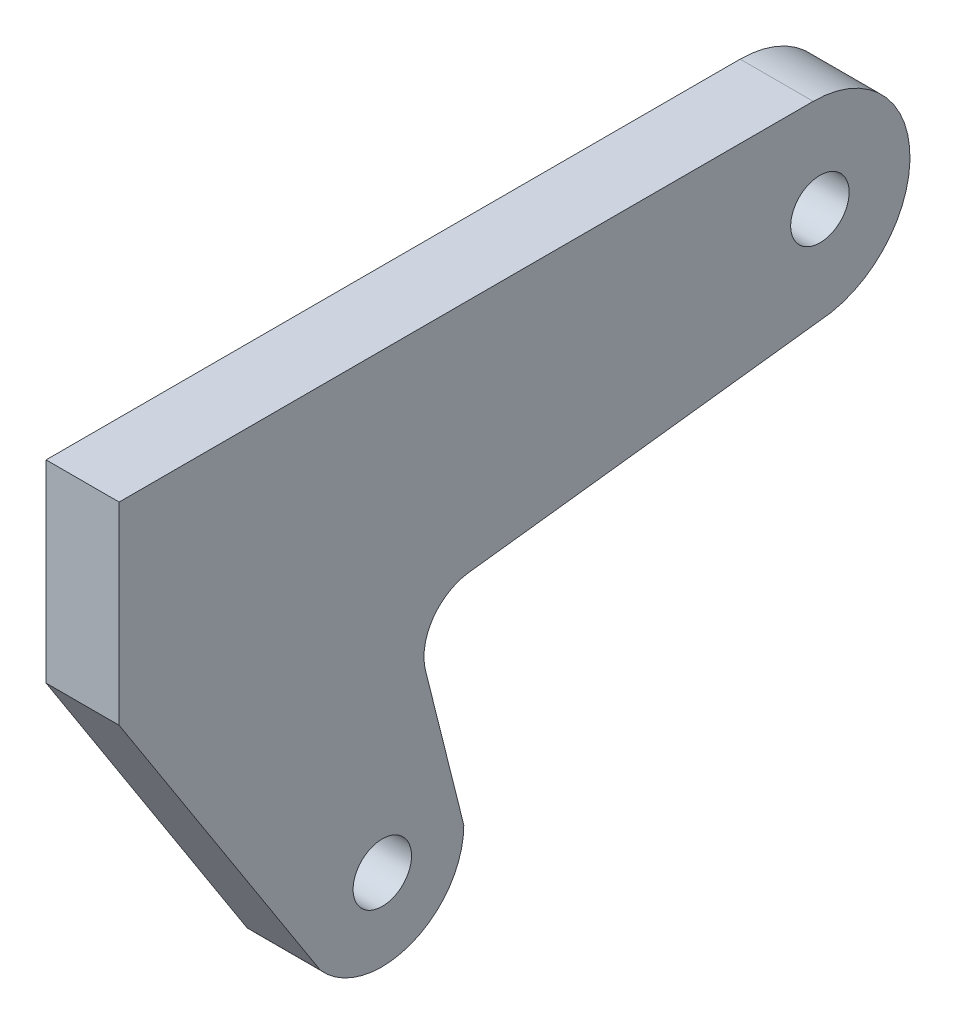
ISO-10303-21;
HEADER;
FILE_DESCRIPTION(('STEP AP214'),'2;1');
FILE_NAME('part.step','',(''),(''),'','','');
FILE_SCHEMA(('AUTOMOTIVE_DESIGN { 1 0 10303 214 1 1 1 1 }'));
ENDSEC;
DATA;
#1=APPLICATION_CONTEXT('core data for automotive mechanical design processes');
#2=APPLICATION_PROTOCOL_DEFINITION('international standard','automotive_design',2000,#1);
#3=PRODUCT_CONTEXT('',#1,'mechanical');
#4=PRODUCT('Part','Part','',(#3));
#5=PRODUCT_RELATED_PRODUCT_CATEGORY('part','',(#4));
#6=PRODUCT_DEFINITION_FORMATION('','',#4);
#7=PRODUCT_DEFINITION_CONTEXT('part definition',#1,'design');
#8=PRODUCT_DEFINITION('design','',#6,#7);
#9=PRODUCT_DEFINITION_SHAPE('','',#8);
#10=(LENGTH_UNIT() NAMED_UNIT(*) SI_UNIT(.MILLI.,.METRE.));
#11=(NAMED_UNIT(*) PLANE_ANGLE_UNIT() SI_UNIT($,.RADIAN.));
#12=(NAMED_UNIT(*) SI_UNIT($,.STERADIAN.) SOLID_ANGLE_UNIT());
#13=UNCERTAINTY_MEASURE_WITH_UNIT(LENGTH_MEASURE(1.E-05),#10,'distance_accuracy_value','');
#14=(GEOMETRIC_REPRESENTATION_CONTEXT(3) GLOBAL_UNCERTAINTY_ASSIGNED_CONTEXT((#13)) GLOBAL_UNIT_ASSIGNED_CONTEXT((#10,
#11,#12)) REPRESENTATION_CONTEXT('',''));
#15=CARTESIAN_POINT('',(0.,0.,0.));
#16=DIRECTION('',(0.,0.,1.));
#17=DIRECTION('',(1.,0.,0.));
#18=AXIS2_PLACEMENT_3D('',#15,#16,#17);
#19=CARTESIAN_POINT('',(10.,0.,0.));
#20=DIRECTION('',(0.,-1.,0.));
#21=DIRECTION('',(0.,0.,-1.));
#22=AXIS2_PLACEMENT_3D('',#19,#20,#21);
#23=PLANE('',#22);
#24=DIRECTION('',(0.,0.,1.));
#25=VECTOR('',#24,1.);
#26=CARTESIAN_POINT('',(0.,0.,0.));
#27=LINE('',#26,#25);
#28=CARTESIAN_POINT('',(0.,1.07552855510562E-13,-94.9883133321983));
#29=VERTEX_POINT('',#28);
#30=CARTESIAN_POINT('',(0.,0.,0.));
#31=VERTEX_POINT('',#30);
#32=EDGE_CURVE('E127',#29,#31,#27,.T.);
#33=ORIENTED_EDGE('',*,*,#32,.T.);
#34=DIRECTION('',(-1.,0.,0.));
#35=VECTOR('',#34,1.);
#36=CARTESIAN_POINT('',(10.,0.,0.));
#37=LINE('',#36,#35);
#38=CARTESIAN_POINT('',(10.,0.,0.));
#39=VERTEX_POINT('',#38);
#40=EDGE_CURVE('E11',#39,#31,#37,.T.);
#41=ORIENTED_EDGE('',*,*,#40,.F.);
#42=DIRECTION('',(0.,0.,1.));
#43=VECTOR('',#42,1.);
#44=CARTESIAN_POINT('',(10.,0.,0.));
#45=LINE('',#44,#43);
#46=CARTESIAN_POINT('',(10.,1.07552855510562E-13,-94.9883133321983));
#47=VERTEX_POINT('',#46);
#48=EDGE_CURVE('E142',#47,#39,#45,.T.);
#49=ORIENTED_EDGE('',*,*,#48,.F.);
#50=DIRECTION('',(-1.,0.,0.));
#51=VECTOR('',#50,1.);
#52=CARTESIAN_POINT('',(10.,1.07552855510562E-13,-94.9883133321983));
#53=LINE('',#52,#51);
#54=EDGE_CURVE('E123',#47,#29,#53,.T.);
#55=ORIENTED_EDGE('',*,*,#54,.T.);
#56=EDGE_LOOP('',(#33,#41,#49,#55));
#57=FACE_BOUND('',#56,.T.);
#58=ADVANCED_FACE('F31',(#57),#23,.F.);
#59=CARTESIAN_POINT('',(10.,0.,0.));
#60=DIRECTION('',(0.,-1.76242441378472E-13,-1.));
#61=DIRECTION('',(0.,1.,-1.76242441378472E-13));
#62=AXIS2_PLACEMENT_3D('',#59,#60,#61);
#63=PLANE('',#62);
#64=DIRECTION('',(0.,-1.,1.76242441378472E-13));
#65=VECTOR('',#64,1.);
#66=CARTESIAN_POINT('',(0.,0.,0.));
#67=LINE('',#66,#65);
#68=CARTESIAN_POINT('',(0.,-26.45751311066,4.66293670342566E-12));
#69=VERTEX_POINT('',#68);
#70=EDGE_CURVE('E130',#31,#69,#67,.T.);
#71=ORIENTED_EDGE('',*,*,#70,.T.);
#72=DIRECTION('',(-1.,0.,0.));
#73=VECTOR('',#72,1.);
#74=CARTESIAN_POINT('',(10.,-26.45751311066,4.66293670342566E-12));
#75=LINE('',#74,#73);
#76=CARTESIAN_POINT('',(10.,-26.45751311066,4.66293670342566E-12));
#77=VERTEX_POINT('',#76);
#78=EDGE_CURVE('E39',#77,#69,#75,.T.);
#79=ORIENTED_EDGE('',*,*,#78,.F.);
#80=DIRECTION('',(0.,-1.,1.76242441378472E-13));
#81=VECTOR('',#80,1.);
#82=CARTESIAN_POINT('',(10.,0.,0.));
#83=LINE('',#82,#81);
#84=EDGE_CURVE('E90',#39,#77,#83,.T.);
#85=ORIENTED_EDGE('',*,*,#84,.F.);
#86=ORIENTED_EDGE('',*,*,#40,.T.);
#87=EDGE_LOOP('',(#71,#79,#85,#86));
#88=FACE_BOUND('',#87,.T.);
#89=ADVANCED_FACE('F211',(#88),#63,.F.);
#90=CARTESIAN_POINT('',(10.,-26.45751311066,4.66293670342566E-12));
#91=DIRECTION('',(0.,0.541064822227858,-0.840980890477029));
#92=DIRECTION('',(0.,0.840980890477029,0.541064822227858));
#93=AXIS2_PLACEMENT_3D('',#90,#91,#92);
#94=PLANE('',#93);
#95=DIRECTION('',(0.,-0.840980890477029,-0.541064822227858));
#96=VECTOR('',#95,1.);
#97=CARTESIAN_POINT('',(0.,-26.45751311066,4.66293670342566E-12));
#98=LINE('',#97,#96);
#99=CARTESIAN_POINT('',(0.,-69.2326518230064,-27.5203908736091));
#100=VERTEX_POINT('',#99);
#101=EDGE_CURVE('E133',#69,#100,#98,.T.);
#102=ORIENTED_EDGE('',*,*,#101,.T.);
#103=DIRECTION('',(-1.,0.,0.));
#104=VECTOR('',#103,1.);
#105=CARTESIAN_POINT('',(10.,-69.2326518230064,-27.5203908736091));
#106=LINE('',#105,#104);
#107=CARTESIAN_POINT('',(10.,-69.2326518230064,-27.5203908736091));
#108=VERTEX_POINT('',#107);
#109=EDGE_CURVE('E149',#108,#100,#106,.T.);
#110=ORIENTED_EDGE('',*,*,#109,.F.);
#111=DIRECTION('',(0.,-0.840980890477029,-0.541064822227858));
#112=VECTOR('',#111,1.);
#113=CARTESIAN_POINT('',(10.,-26.45751311066,4.66293670342566E-12));
#114=LINE('',#113,#112);
#115=EDGE_CURVE('E157',#77,#108,#114,.T.);
#116=ORIENTED_EDGE('',*,*,#115,.F.);
#117=ORIENTED_EDGE('',*,*,#78,.T.);
#118=EDGE_LOOP('',(#102,#110,#116,#117));
#119=FACE_BOUND('',#118,.T.);
#120=ADVANCED_FACE('F155',(#119),#94,.F.);
#121=CARTESIAN_POINT('',(10.,-61.8708429752599,-35.9650885838064));
#122=DIRECTION('',(-1.,0.,0.));
#123=DIRECTION('',(0.,0.,1.));
#124=AXIS2_PLACEMENT_3D('',#121,#122,#123);
#125=CYLINDRICAL_SURFACE('',#124,11.2030865803746);
#126=CARTESIAN_POINT('',(0.,-61.8708429752599,-35.9650885838064));
#127=DIRECTION('',(1.,0.,0.));
#128=DIRECTION('',(0.,0.,-1.));
#129=AXIS2_PLACEMENT_3D('',#126,#127,#128);
#130=CIRCLE('',#129,11.2030865803746);
#131=CARTESIAN_POINT('',(0.,-61.8708429752599,-47.1681751641811));
#132=VERTEX_POINT('',#131);
#133=EDGE_CURVE('E135',#100,#132,#130,.T.);
#134=ORIENTED_EDGE('',*,*,#133,.T.);
#135=DIRECTION('',(-1.,0.,0.));
#136=VECTOR('',#135,1.);
#137=CARTESIAN_POINT('',(10.,-61.8708429752599,-47.1681751641811));
#138=LINE('',#137,#136);
#139=CARTESIAN_POINT('',(10.,-61.8708429752599,-47.1681751641811));
#140=VERTEX_POINT('',#139);
#141=EDGE_CURVE('E146',#140,#132,#138,.T.);
#142=ORIENTED_EDGE('',*,*,#141,.F.);
#143=CARTESIAN_POINT('',(10.,-61.8708429752599,-35.9650885838064));
#144=DIRECTION('',(1.,0.,0.));
#145=DIRECTION('',(0.,0.,-1.));
#146=AXIS2_PLACEMENT_3D('',#143,#144,#145);
#147=CIRCLE('',#146,11.2030865803746);
#148=EDGE_CURVE('E169',#108,#140,#147,.T.);
#149=ORIENTED_EDGE('',*,*,#148,.F.);
#150=ORIENTED_EDGE('',*,*,#109,.T.);
#151=EDGE_LOOP('',(#134,#142,#149,#150));
#152=FACE_BOUND('',#151,.T.);
#153=ADVANCED_FACE('F165',(#152),#125,.T.);
#154=CARTESIAN_POINT('',(10.,-40.9215711840878,-41.9252592829969));
#155=DIRECTION('',(0.,-0.242779588289773,0.97008147673783));
#156=DIRECTION('',(0.,-0.97008147673783,-0.242779588289773));
#157=AXIS2_PLACEMENT_3D('',#154,#155,#156);
#158=PLANE('',#157);
#159=DIRECTION('',(0.,0.970081476737829,0.242779588289773));
#160=VECTOR('',#159,1.);
#161=CARTESIAN_POINT('',(0.,-40.9215711840878,-41.9252592829969));
#162=LINE('',#161,#160);
#163=CARTESIAN_POINT('',(0.,-40.9215711840878,-41.9252592829969));
#164=VERTEX_POINT('',#163);
#165=EDGE_CURVE('E137',#132,#164,#162,.T.);
#166=ORIENTED_EDGE('',*,*,#165,.T.);
#167=DIRECTION('',(-1.,0.,0.));
#168=VECTOR('',#167,1.);
#169=CARTESIAN_POINT('',(10.,-40.9215711840878,-41.9252592829969));
#170=LINE('',#169,#168);
#171=CARTESIAN_POINT('',(10.,-40.9215711840878,-41.9252592829969));
#172=VERTEX_POINT('',#171);
#173=EDGE_CURVE('E118',#172,#164,#170,.T.);
#174=ORIENTED_EDGE('',*,*,#173,.F.);
#175=DIRECTION('',(0.,0.970081476737829,0.242779588289773));
#176=VECTOR('',#175,1.);
#177=CARTESIAN_POINT('',(10.,-40.9215711840878,-41.9252592829969));
#178=LINE('',#177,#176);
#179=EDGE_CURVE('E109',#140,#172,#178,.T.);
#180=ORIENTED_EDGE('',*,*,#179,.F.);
#181=ORIENTED_EDGE('',*,*,#141,.T.);
#182=EDGE_LOOP('',(#166,#174,#180,#181));
#183=FACE_BOUND('',#182,.T.);
#184=ADVANCED_FACE('F168',(#183),#158,.F.);
#185=CARTESIAN_POINT('',(10.,-39.2221140660595,-48.7158296201617));
#186=DIRECTION('',(-1.,0.,0.));
#187=DIRECTION('',(0.,0.,1.));
#188=AXIS2_PLACEMENT_3D('',#185,#186,#187);
#189=CYLINDRICAL_SURFACE('',#188,6.99999999999999);
#190=CARTESIAN_POINT('',(0.,-39.2221140660595,-48.7158296201617));
#191=DIRECTION('',(-1.,0.,0.));
#192=DIRECTION('',(0.,0.,-1.));
#193=AXIS2_PLACEMENT_3D('',#190,#191,#192);
#194=CIRCLE('',#193,6.99999999999999);
#195=CARTESIAN_POINT('',(0.,-32.273126802079,-47.8722799742973));
#196=VERTEX_POINT('',#195);
#197=EDGE_CURVE('E117',#164,#196,#194,.T.);
#198=ORIENTED_EDGE('',*,*,#197,.T.);
#199=DIRECTION('',(-1.,0.,0.));
#200=VECTOR('',#199,1.);
#201=CARTESIAN_POINT('',(10.,-32.273126802079,-47.8722799742973));
#202=LINE('',#201,#200);
#203=CARTESIAN_POINT('',(10.,-32.273126802079,-47.8722799742973));
#204=VERTEX_POINT('',#203);
#205=EDGE_CURVE('E114',#204,#196,#202,.T.);
#206=ORIENTED_EDGE('',*,*,#205,.F.);
#207=CARTESIAN_POINT('',(10.,-39.2221140660595,-48.7158296201617));
#208=DIRECTION('',(-1.,0.,0.));
#209=DIRECTION('',(0.,0.,-1.));
#210=AXIS2_PLACEMENT_3D('',#207,#208,#209);
#211=CIRCLE('',#210,6.99999999999999);
#212=EDGE_CURVE('E103',#172,#204,#211,.T.);
#213=ORIENTED_EDGE('',*,*,#212,.F.);
#214=ORIENTED_EDGE('',*,*,#173,.T.);
#215=EDGE_LOOP('',(#198,#206,#213,#214));
#216=FACE_BOUND('',#215,.T.);
#217=ADVANCED_FACE('F115',(#216),#189,.F.);
#218=CARTESIAN_POINT('',(10.,-26.4575131106546,-95.7801010160695));
#219=DIRECTION('',(0.,0.992712466282911,0.120507092266392));
#220=DIRECTION('',(0.,-0.120507092266392,0.992712466282911));
#221=AXIS2_PLACEMENT_3D('',#218,#219,#220);
#222=PLANE('',#221);
#223=DIRECTION('',(0.,0.120507092266392,-0.992712466282911));
#224=VECTOR('',#223,1.);
#225=CARTESIAN_POINT('',(0.,-26.4575131106546,-95.7801010160695));
#226=LINE('',#225,#224);
#227=CARTESIAN_POINT('',(0.,-26.4575131106546,-95.7801010160695));
#228=VERTEX_POINT('',#227);
#229=EDGE_CURVE('E76',#196,#228,#226,.T.);
#230=ORIENTED_EDGE('',*,*,#229,.T.);
#231=DIRECTION('',(-1.,0.,0.));
#232=VECTOR('',#231,1.);
#233=CARTESIAN_POINT('',(10.,-26.4575131106546,-95.7801010160695));
#234=LINE('',#233,#232);
#235=CARTESIAN_POINT('',(10.,-26.4575131106546,-95.7801010160695));
#236=VERTEX_POINT('',#235);
#237=EDGE_CURVE('E119',#236,#228,#234,.T.);
#238=ORIENTED_EDGE('',*,*,#237,.F.);
#239=DIRECTION('',(0.,0.120507092266392,-0.992712466282911));
#240=VECTOR('',#239,1.);
#241=CARTESIAN_POINT('',(10.,-26.4575131106546,-95.7801010160695));
#242=LINE('',#241,#240);
#243=EDGE_CURVE('E107',#204,#236,#242,.T.);
#244=ORIENTED_EDGE('',*,*,#243,.F.);
#245=ORIENTED_EDGE('',*,*,#205,.T.);
#246=EDGE_LOOP('',(#230,#238,#244,#245));
#247=FACE_BOUND('',#246,.T.);
#248=ADVANCED_FACE('F121',(#247),#222,.F.);
#249=CARTESIAN_POINT('',(10.,-13.240604375901,-94.9883133321983));
#250=DIRECTION('',(-1.,0.,0.));
#251=DIRECTION('',(0.,0.,1.));
#252=AXIS2_PLACEMENT_3D('',#249,#250,#251);
#253=CYLINDRICAL_SURFACE('',#252,13.2406043759011);
#254=CARTESIAN_POINT('',(0.,-13.240604375901,-94.9883133321983));
#255=DIRECTION('',(1.,0.,0.));
#256=DIRECTION('',(0.,0.,1.));
#257=AXIS2_PLACEMENT_3D('',#254,#255,#256);
#258=CIRCLE('',#257,13.2406043759011);
#259=EDGE_CURVE('E82',#228,#29,#258,.T.);
#260=ORIENTED_EDGE('',*,*,#259,.T.);
#261=ORIENTED_EDGE('',*,*,#54,.F.);
#262=CARTESIAN_POINT('',(10.,-13.240604375901,-94.9883133321983));
#263=DIRECTION('',(1.,0.,0.));
#264=DIRECTION('',(0.,0.,1.));
#265=AXIS2_PLACEMENT_3D('',#262,#263,#264);
#266=CIRCLE('',#265,13.2406043759011);
#267=EDGE_CURVE('E47',#236,#47,#266,.T.);
#268=ORIENTED_EDGE('',*,*,#267,.F.);
#269=ORIENTED_EDGE('',*,*,#237,.T.);
#270=EDGE_LOOP('',(#260,#261,#268,#269));
#271=FACE_BOUND('',#270,.T.);
#272=ADVANCED_FACE('F198',(#271),#253,.T.);
#273=CARTESIAN_POINT('',(10.,-13.240604375901,-94.9883133321983));
#274=DIRECTION('',(-1.,0.,0.));
#275=DIRECTION('',(0.,0.,1.));
#276=AXIS2_PLACEMENT_3D('',#273,#274,#275);
#277=PLANE('',#276);
#278=CARTESIAN_POINT('',(10.,-61.9267327378232,-36.0154129928026));
#279=DIRECTION('',(1.,0.,0.));
#280=DIRECTION('',(0.,0.,-1.));
#281=AXIS2_PLACEMENT_3D('',#278,#279,#280);
#282=CIRCLE('',#281,4.00000000000001);
#283=CARTESIAN_POINT('',(10.,-61.9267327378232,-40.0154129928026));
#284=VERTEX_POINT('',#283);
#285=EDGE_CURVE('E181',#284,#284,#282,.T.);
#286=ORIENTED_EDGE('',*,*,#285,.F.);
#287=EDGE_LOOP('',(#286));
#288=FACE_BOUND('',#287,.T.);
#289=CARTESIAN_POINT('',(10.,-13.2287565553229,-95.9043978258456));
#290=DIRECTION('',(1.,0.,0.));
#291=DIRECTION('',(0.,0.,-1.));
#292=AXIS2_PLACEMENT_3D('',#289,#290,#291);
#293=CIRCLE('',#292,4.00000000000003);
#294=CARTESIAN_POINT('',(10.,-13.2287565553229,-99.9043978258456));
#295=VERTEX_POINT('',#294);
#296=EDGE_CURVE('E175',#295,#295,#293,.T.);
#297=ORIENTED_EDGE('',*,*,#296,.F.);
#298=EDGE_LOOP('',(#297));
#299=FACE_BOUND('',#298,.T.);
#300=ORIENTED_EDGE('',*,*,#48,.T.);
#301=ORIENTED_EDGE('',*,*,#84,.T.);
#302=ORIENTED_EDGE('',*,*,#115,.T.);
#303=ORIENTED_EDGE('',*,*,#148,.T.);
#304=ORIENTED_EDGE('',*,*,#179,.T.);
#305=ORIENTED_EDGE('',*,*,#212,.T.);
#306=ORIENTED_EDGE('',*,*,#243,.T.);
#307=ORIENTED_EDGE('',*,*,#267,.T.);
#308=EDGE_LOOP('',(#300,#301,#302,#303,#304,#305,#306,#307));
#309=FACE_BOUND('',#308,.T.);
#310=ADVANCED_FACE('F105',(#288,#299,#309),#277,.F.);
#311=CARTESIAN_POINT('',(0.,-13.240604375901,-94.9883133321983));
#312=DIRECTION('',(-1.,0.,0.));
#313=DIRECTION('',(0.,0.,1.));
#314=AXIS2_PLACEMENT_3D('',#311,#312,#313);
#315=PLANE('',#314);
#316=CARTESIAN_POINT('',(0.,-61.9267327378232,-36.0154129928026));
#317=DIRECTION('',(1.,0.,0.));
#318=DIRECTION('',(0.,0.,-1.));
#319=AXIS2_PLACEMENT_3D('',#316,#317,#318);
#320=CIRCLE('',#319,4.00000000000001);
#321=CARTESIAN_POINT('',(0.,-61.9267327378232,-40.0154129928026));
#322=VERTEX_POINT('',#321);
#323=EDGE_CURVE('E178',#322,#322,#320,.T.);
#324=ORIENTED_EDGE('',*,*,#323,.T.);
#325=EDGE_LOOP('',(#324));
#326=FACE_BOUND('',#325,.T.);
#327=CARTESIAN_POINT('',(0.,-13.2287565553229,-95.9043978258456));
#328=DIRECTION('',(1.,0.,0.));
#329=DIRECTION('',(0.,0.,-1.));
#330=AXIS2_PLACEMENT_3D('',#327,#328,#329);
#331=CIRCLE('',#330,4.00000000000003);
#332=CARTESIAN_POINT('',(0.,-13.2287565553229,-99.9043978258456));
#333=VERTEX_POINT('',#332);
#334=EDGE_CURVE('E131',#333,#333,#331,.T.);
#335=ORIENTED_EDGE('',*,*,#334,.T.);
#336=EDGE_LOOP('',(#335));
#337=FACE_BOUND('',#336,.T.);
#338=ORIENTED_EDGE('',*,*,#32,.F.);
#339=ORIENTED_EDGE('',*,*,#259,.F.);
#340=ORIENTED_EDGE('',*,*,#229,.F.);
#341=ORIENTED_EDGE('',*,*,#197,.F.);
#342=ORIENTED_EDGE('',*,*,#165,.F.);
#343=ORIENTED_EDGE('',*,*,#133,.F.);
#344=ORIENTED_EDGE('',*,*,#101,.F.);
#345=ORIENTED_EDGE('',*,*,#70,.F.);
#346=EDGE_LOOP('',(#338,#339,#340,#341,#342,#343,#344,#345));
#347=FACE_BOUND('',#346,.T.);
#348=ADVANCED_FACE('F161',(#326,#337,#347),#315,.T.);
#349=CARTESIAN_POINT('',(0.,-13.2287565553229,-95.9043978258456));
#350=DIRECTION('',(1.,0.,0.));
#351=DIRECTION('',(0.,0.,-1.));
#352=AXIS2_PLACEMENT_3D('',#349,#350,#351);
#353=CYLINDRICAL_SURFACE('',#352,4.00000000000003);
#354=ORIENTED_EDGE('',*,*,#334,.F.);
#355=EDGE_LOOP('',(#354));
#356=FACE_BOUND('',#355,.T.);
#357=ORIENTED_EDGE('',*,*,#296,.T.);
#358=EDGE_LOOP('',(#357));
#359=FACE_BOUND('',#358,.T.);
#360=ADVANCED_FACE('F192',(#356,#359),#353,.F.);
#361=CARTESIAN_POINT('',(0.,-61.9267327378232,-36.0154129928026));
#362=DIRECTION('',(1.,0.,0.));
#363=DIRECTION('',(0.,0.,-1.));
#364=AXIS2_PLACEMENT_3D('',#361,#362,#363);
#365=CYLINDRICAL_SURFACE('',#364,4.00000000000001);
#366=ORIENTED_EDGE('',*,*,#323,.F.);
#367=EDGE_LOOP('',(#366));
#368=FACE_BOUND('',#367,.T.);
#369=ORIENTED_EDGE('',*,*,#285,.T.);
#370=EDGE_LOOP('',(#369));
#371=FACE_BOUND('',#370,.T.);
#372=ADVANCED_FACE('F189',(#368,#371),#365,.F.);
#373=CLOSED_SHELL('',(#58,#89,#120,#153,#184,#217,#248,#272,#310,#348,#360,#372));
#374=MANIFOLD_SOLID_BREP('B2',#373);
#375=ADVANCED_BREP_SHAPE_REPRESENTATION('',(#18,#374),#14);
#376=SHAPE_DEFINITION_REPRESENTATION(#9,#375);
ENDSEC;
END-ISO-10303-21;
